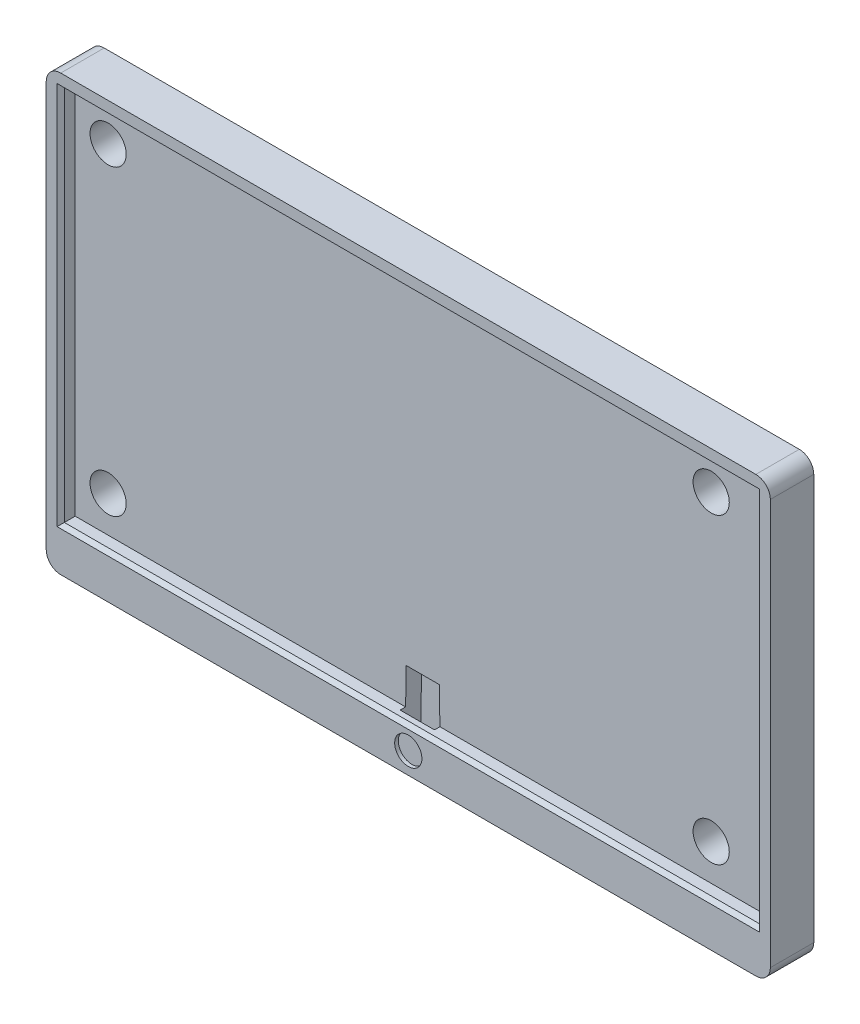
ISO-10303-21;
HEADER;
FILE_DESCRIPTION(('STEP AP214'),'2;1');
FILE_NAME('part.step','',(''),(''),'','','');
FILE_SCHEMA(('AUTOMOTIVE_DESIGN { 1 0 10303 214 1 1 1 1 }'));
ENDSEC;
DATA;
#1=APPLICATION_CONTEXT('core data for automotive mechanical design processes');
#2=APPLICATION_PROTOCOL_DEFINITION('international standard','automotive_design',2000,#1);
#3=PRODUCT_CONTEXT('',#1,'mechanical');
#4=PRODUCT('Part','Part','',(#3));
#5=PRODUCT_RELATED_PRODUCT_CATEGORY('part','',(#4));
#6=PRODUCT_DEFINITION_FORMATION('','',#4);
#7=PRODUCT_DEFINITION_CONTEXT('part definition',#1,'design');
#8=PRODUCT_DEFINITION('design','',#6,#7);
#9=PRODUCT_DEFINITION_SHAPE('','',#8);
#10=(LENGTH_UNIT() NAMED_UNIT(*) SI_UNIT(.MILLI.,.METRE.));
#11=(NAMED_UNIT(*) PLANE_ANGLE_UNIT() SI_UNIT($,.RADIAN.));
#12=(NAMED_UNIT(*) SI_UNIT($,.STERADIAN.) SOLID_ANGLE_UNIT());
#13=UNCERTAINTY_MEASURE_WITH_UNIT(LENGTH_MEASURE(1.E-05),#10,'distance_accuracy_value','');
#14=(GEOMETRIC_REPRESENTATION_CONTEXT(3) GLOBAL_UNCERTAINTY_ASSIGNED_CONTEXT((#13)) GLOBAL_UNIT_ASSIGNED_CONTEXT((#10,
#11,#12)) REPRESENTATION_CONTEXT('',''));
#15=CARTESIAN_POINT('',(0.,0.,0.));
#16=DIRECTION('',(0.,0.,1.));
#17=DIRECTION('',(1.,0.,0.));
#18=AXIS2_PLACEMENT_3D('',#15,#16,#17);
#19=CARTESIAN_POINT('',(0.,-19.,0.));
#20=DIRECTION('',(0.,-1.,0.));
#21=DIRECTION('',(0.,0.,-1.));
#22=AXIS2_PLACEMENT_3D('',#19,#20,#21);
#23=PLANE('',#22);
#24=DIRECTION('',(0.,0.,-1.));
#25=VECTOR('',#24,1.);
#26=CARTESIAN_POINT('',(2.28299428578961,-19.,0.));
#27=LINE('',#26,#25);
#28=CARTESIAN_POINT('',(2.28299428578961,-19.,-1.15));
#29=VERTEX_POINT('',#28);
#30=CARTESIAN_POINT('',(2.28299428578961,-19.,1.));
#31=VERTEX_POINT('',#30);
#32=EDGE_CURVE('E237',#29,#31,#27,.F.);
#33=ORIENTED_EDGE('',*,*,#32,.T.);
#34=DIRECTION('',(-1.,0.,0.));
#35=VECTOR('',#34,1.);
#36=CARTESIAN_POINT('',(0.,-19.,1.));
#37=LINE('',#36,#35);
#38=CARTESIAN_POINT('',(-2.2829942857896,-19.,1.));
#39=VERTEX_POINT('',#38);
#40=EDGE_CURVE('E263',#31,#39,#37,.T.);
#41=ORIENTED_EDGE('',*,*,#40,.T.);
#42=DIRECTION('',(0.,0.,1.));
#43=VECTOR('',#42,1.);
#44=CARTESIAN_POINT('',(-2.2829942857896,-19.,0.));
#45=LINE('',#44,#43);
#46=CARTESIAN_POINT('',(-2.2829942857896,-19.,-1.15));
#47=VERTEX_POINT('',#46);
#48=EDGE_CURVE('E225',#39,#47,#45,.F.);
#49=ORIENTED_EDGE('',*,*,#48,.T.);
#50=DIRECTION('',(1.,0.,0.));
#51=VECTOR('',#50,1.);
#52=CARTESIAN_POINT('',(2.475,-19.,-1.15));
#53=LINE('',#52,#51);
#54=EDGE_CURVE('E221',#47,#29,#53,.T.);
#55=ORIENTED_EDGE('',*,*,#54,.T.);
#56=EDGE_LOOP('',(#33,#41,#49,#55));
#57=FACE_BOUND('',#56,.T.);
#58=ADVANCED_FACE('F37',(#57),#23,.T.);
#59=CARTESIAN_POINT('',(-50.,30.,-3.));
#60=DIRECTION('',(-1.,0.,0.));
#61=DIRECTION('',(0.,0.,1.));
#62=AXIS2_PLACEMENT_3D('',#59,#60,#61);
#63=PLANE('',#62);
#64=DIRECTION('',(0.,-1.,0.));
#65=VECTOR('',#64,1.);
#66=CARTESIAN_POINT('',(-50.,30.,-3.));
#67=LINE('',#66,#65);
#68=CARTESIAN_POINT('',(-50.,28.,-3.));
#69=VERTEX_POINT('',#68);
#70=CARTESIAN_POINT('',(-50.,-28.,-3.));
#71=VERTEX_POINT('',#70);
#72=EDGE_CURVE('E251',#69,#71,#67,.T.);
#73=ORIENTED_EDGE('',*,*,#72,.T.);
#74=DIRECTION('',(0.,0.,1.));
#75=VECTOR('',#74,1.);
#76=CARTESIAN_POINT('',(-50.,-28.,-3.));
#77=LINE('',#76,#75);
#78=CARTESIAN_POINT('',(-50.,-28.,3.));
#79=VERTEX_POINT('',#78);
#80=EDGE_CURVE('E311',#71,#79,#77,.T.);
#81=ORIENTED_EDGE('',*,*,#80,.T.);
#82=DIRECTION('',(0.,-1.,0.));
#83=VECTOR('',#82,1.);
#84=CARTESIAN_POINT('',(-50.,30.,3.));
#85=LINE('',#84,#83);
#86=CARTESIAN_POINT('',(-50.,28.,3.));
#87=VERTEX_POINT('',#86);
#88=EDGE_CURVE('E238',#87,#79,#85,.T.);
#89=ORIENTED_EDGE('',*,*,#88,.F.);
#90=DIRECTION('',(0.,0.,1.));
#91=VECTOR('',#90,1.);
#92=CARTESIAN_POINT('',(-50.,28.,-3.));
#93=LINE('',#92,#91);
#94=EDGE_CURVE('E309',#87,#69,#93,.F.);
#95=ORIENTED_EDGE('',*,*,#94,.T.);
#96=EDGE_LOOP('',(#73,#81,#89,#95));
#97=FACE_BOUND('',#96,.T.);
#98=ADVANCED_FACE('F390',(#97),#63,.T.);
#99=CARTESIAN_POINT('',(-50.,30.,-3.));
#100=DIRECTION('',(0.,1.,0.));
#101=DIRECTION('',(-1.,0.,0.));
#102=AXIS2_PLACEMENT_3D('',#99,#100,#101);
#103=PLANE('',#102);
#104=DIRECTION('',(-1.,0.,0.));
#105=VECTOR('',#104,1.);
#106=CARTESIAN_POINT('',(-50.,30.,3.));
#107=LINE('',#106,#105);
#108=CARTESIAN_POINT('',(48.,30.,3.));
#109=VERTEX_POINT('',#108);
#110=CARTESIAN_POINT('',(-48.,30.,3.));
#111=VERTEX_POINT('',#110);
#112=EDGE_CURVE('E248',#109,#111,#107,.T.);
#113=ORIENTED_EDGE('',*,*,#112,.F.);
#114=DIRECTION('',(0.,0.,1.));
#115=VECTOR('',#114,1.);
#116=CARTESIAN_POINT('',(48.,30.,-3.));
#117=LINE('',#116,#115);
#118=CARTESIAN_POINT('',(48.,30.,-3.));
#119=VERTEX_POINT('',#118);
#120=EDGE_CURVE('E307',#109,#119,#117,.F.);
#121=ORIENTED_EDGE('',*,*,#120,.T.);
#122=DIRECTION('',(-1.,0.,0.));
#123=VECTOR('',#122,1.);
#124=CARTESIAN_POINT('',(-50.,30.,-3.));
#125=LINE('',#124,#123);
#126=CARTESIAN_POINT('',(-48.,30.,-3.));
#127=VERTEX_POINT('',#126);
#128=EDGE_CURVE('E260',#119,#127,#125,.T.);
#129=ORIENTED_EDGE('',*,*,#128,.T.);
#130=DIRECTION('',(0.,0.,1.));
#131=VECTOR('',#130,1.);
#132=CARTESIAN_POINT('',(-48.,30.,-3.));
#133=LINE('',#132,#131);
#134=EDGE_CURVE('E304',#127,#111,#133,.T.);
#135=ORIENTED_EDGE('',*,*,#134,.T.);
#136=EDGE_LOOP('',(#113,#121,#129,#135));
#137=FACE_BOUND('',#136,.T.);
#138=ADVANCED_FACE('F396',(#137),#103,.T.);
#139=CARTESIAN_POINT('',(50.,30.,-3.));
#140=DIRECTION('',(1.,0.,0.));
#141=DIRECTION('',(0.,0.,-1.));
#142=AXIS2_PLACEMENT_3D('',#139,#140,#141);
#143=PLANE('',#142);
#144=DIRECTION('',(0.,1.,0.));
#145=VECTOR('',#144,1.);
#146=CARTESIAN_POINT('',(50.,30.,3.));
#147=LINE('',#146,#145);
#148=CARTESIAN_POINT('',(50.,-28.,3.));
#149=VERTEX_POINT('',#148);
#150=CARTESIAN_POINT('',(50.,28.,3.));
#151=VERTEX_POINT('',#150);
#152=EDGE_CURVE('E245',#149,#151,#147,.T.);
#153=ORIENTED_EDGE('',*,*,#152,.F.);
#154=DIRECTION('',(0.,0.,1.));
#155=VECTOR('',#154,1.);
#156=CARTESIAN_POINT('',(50.,-28.,-3.));
#157=LINE('',#156,#155);
#158=CARTESIAN_POINT('',(50.,-28.,-3.));
#159=VERTEX_POINT('',#158);
#160=EDGE_CURVE('E294',#149,#159,#157,.F.);
#161=ORIENTED_EDGE('',*,*,#160,.T.);
#162=DIRECTION('',(0.,1.,0.));
#163=VECTOR('',#162,1.);
#164=CARTESIAN_POINT('',(50.,30.,-3.));
#165=LINE('',#164,#163);
#166=CARTESIAN_POINT('',(50.,28.,-3.));
#167=VERTEX_POINT('',#166);
#168=EDGE_CURVE('E257',#159,#167,#165,.T.);
#169=ORIENTED_EDGE('',*,*,#168,.T.);
#170=DIRECTION('',(0.,0.,1.));
#171=VECTOR('',#170,1.);
#172=CARTESIAN_POINT('',(50.,28.,-3.));
#173=LINE('',#172,#171);
#174=EDGE_CURVE('E291',#167,#151,#173,.T.);
#175=ORIENTED_EDGE('',*,*,#174,.T.);
#176=EDGE_LOOP('',(#153,#161,#169,#175));
#177=FACE_BOUND('',#176,.T.);
#178=ADVANCED_FACE('F423',(#177),#143,.T.);
#179=CARTESIAN_POINT('',(-50.,-30.,-3.));
#180=DIRECTION('',(0.,-1.,0.));
#181=DIRECTION('',(1.,0.,0.));
#182=AXIS2_PLACEMENT_3D('',#179,#180,#181);
#183=PLANE('',#182);
#184=DIRECTION('',(0.,0.,1.));
#185=VECTOR('',#184,1.);
#186=CARTESIAN_POINT('',(2.475,-30.,-1.15));
#187=LINE('',#186,#185);
#188=CARTESIAN_POINT('',(2.475,-30.,-1.15));
#189=VERTEX_POINT('',#188);
#190=CARTESIAN_POINT('',(2.475,-30.,1.75));
#191=VERTEX_POINT('',#190);
#192=EDGE_CURVE('E220',#189,#191,#187,.T.);
#193=ORIENTED_EDGE('',*,*,#192,.F.);
#194=DIRECTION('',(1.,0.,0.));
#195=VECTOR('',#194,1.);
#196=CARTESIAN_POINT('',(2.475,-30.,-1.15));
#197=LINE('',#196,#195);
#198=CARTESIAN_POINT('',(-2.47499999999999,-30.,-1.15));
#199=VERTEX_POINT('',#198);
#200=EDGE_CURVE('E234',#199,#189,#197,.T.);
#201=ORIENTED_EDGE('',*,*,#200,.F.);
#202=DIRECTION('',(0.,0.,-1.));
#203=VECTOR('',#202,1.);
#204=CARTESIAN_POINT('',(-2.47499999999999,-30.,-1.15));
#205=LINE('',#204,#203);
#206=CARTESIAN_POINT('',(-2.47499999999999,-30.,1.75));
#207=VERTEX_POINT('',#206);
#208=EDGE_CURVE('E231',#207,#199,#205,.T.);
#209=ORIENTED_EDGE('',*,*,#208,.F.);
#210=DIRECTION('',(-1.,0.,0.));
#211=VECTOR('',#210,1.);
#212=CARTESIAN_POINT('',(2.475,-30.,1.75));
#213=LINE('',#212,#211);
#214=EDGE_CURVE('E228',#191,#207,#213,.T.);
#215=ORIENTED_EDGE('',*,*,#214,.F.);
#216=EDGE_LOOP('',(#193,#201,#209,#215));
#217=FACE_BOUND('',#216,.T.);
#218=DIRECTION('',(1.,0.,0.));
#219=VECTOR('',#218,1.);
#220=CARTESIAN_POINT('',(-50.,-30.,-3.));
#221=LINE('',#220,#219);
#222=CARTESIAN_POINT('',(-48.,-30.,-3.));
#223=VERTEX_POINT('',#222);
#224=CARTESIAN_POINT('',(48.,-30.,-3.));
#225=VERTEX_POINT('',#224);
#226=EDGE_CURVE('E254',#223,#225,#221,.T.);
#227=ORIENTED_EDGE('',*,*,#226,.T.);
#228=DIRECTION('',(0.,0.,1.));
#229=VECTOR('',#228,1.);
#230=CARTESIAN_POINT('',(48.,-30.,-3.));
#231=LINE('',#230,#229);
#232=CARTESIAN_POINT('',(48.,-30.,3.));
#233=VERTEX_POINT('',#232);
#234=EDGE_CURVE('E280',#225,#233,#231,.T.);
#235=ORIENTED_EDGE('',*,*,#234,.T.);
#236=DIRECTION('',(1.,0.,0.));
#237=VECTOR('',#236,1.);
#238=CARTESIAN_POINT('',(-50.,-30.,3.));
#239=LINE('',#238,#237);
#240=CARTESIAN_POINT('',(-48.,-30.,3.));
#241=VERTEX_POINT('',#240);
#242=EDGE_CURVE('E241',#241,#233,#239,.T.);
#243=ORIENTED_EDGE('',*,*,#242,.F.);
#244=DIRECTION('',(0.,0.,1.));
#245=VECTOR('',#244,1.);
#246=CARTESIAN_POINT('',(-48.,-30.,-3.));
#247=LINE('',#246,#245);
#248=EDGE_CURVE('E278',#241,#223,#247,.F.);
#249=ORIENTED_EDGE('',*,*,#248,.T.);
#250=EDGE_LOOP('',(#227,#235,#243,#249));
#251=FACE_BOUND('',#250,.T.);
#252=ADVANCED_FACE('F419',(#217,#251),#183,.T.);
#253=CARTESIAN_POINT('',(0.,0.,-3.));
#254=DIRECTION('',(0.,0.,1.));
#255=DIRECTION('',(1.,0.,0.));
#256=AXIS2_PLACEMENT_3D('',#253,#254,#255);
#257=PLANE('',#256);
#258=CARTESIAN_POINT('',(39.8327710388283,22.8,-3.));
#259=DIRECTION('',(0.,0.,1.));
#260=DIRECTION('',(1.,0.,0.));
#261=AXIS2_PLACEMENT_3D('',#258,#259,#260);
#262=CIRCLE('',#261,2.5);
#263=CARTESIAN_POINT('',(42.3327710388283,22.8,-3.));
#264=VERTEX_POINT('',#263);
#265=EDGE_CURVE('E343',#264,#264,#262,.T.);
#266=ORIENTED_EDGE('',*,*,#265,.T.);
#267=EDGE_LOOP('',(#266));
#268=FACE_BOUND('',#267,.T.);
#269=CARTESIAN_POINT('',(39.8327710388283,-19.,-3.));
#270=DIRECTION('',(0.,0.,1.));
#271=DIRECTION('',(1.,0.,0.));
#272=AXIS2_PLACEMENT_3D('',#269,#270,#271);
#273=CIRCLE('',#272,2.5);
#274=CARTESIAN_POINT('',(42.3327710388283,-19.,-3.));
#275=VERTEX_POINT('',#274);
#276=EDGE_CURVE('E352',#275,#275,#273,.T.);
#277=ORIENTED_EDGE('',*,*,#276,.T.);
#278=EDGE_LOOP('',(#277));
#279=FACE_BOUND('',#278,.T.);
#280=CARTESIAN_POINT('',(-43.4539320423583,-19.,-3.));
#281=DIRECTION('',(0.,0.,1.));
#282=DIRECTION('',(1.,0.,0.));
#283=AXIS2_PLACEMENT_3D('',#280,#281,#282);
#284=CIRCLE('',#283,2.5);
#285=CARTESIAN_POINT('',(-40.9539320423583,-19.,-3.));
#286=VERTEX_POINT('',#285);
#287=EDGE_CURVE('E358',#286,#286,#284,.T.);
#288=ORIENTED_EDGE('',*,*,#287,.T.);
#289=EDGE_LOOP('',(#288));
#290=FACE_BOUND('',#289,.T.);
#291=CARTESIAN_POINT('',(-43.4539320423583,22.8,-3.));
#292=DIRECTION('',(0.,0.,1.));
#293=DIRECTION('',(1.,0.,0.));
#294=AXIS2_PLACEMENT_3D('',#291,#292,#293);
#295=CIRCLE('',#294,2.5);
#296=CARTESIAN_POINT('',(-40.9539320423583,22.8,-3.));
#297=VERTEX_POINT('',#296);
#298=EDGE_CURVE('E197',#297,#297,#295,.T.);
#299=ORIENTED_EDGE('',*,*,#298,.T.);
#300=EDGE_LOOP('',(#299));
#301=FACE_BOUND('',#300,.T.);
#302=ORIENTED_EDGE('',*,*,#168,.F.);
#303=CARTESIAN_POINT('',(48.,-28.,-3.));
#304=DIRECTION('',(0.,0.,1.));
#305=DIRECTION('',(1.,0.,0.));
#306=AXIS2_PLACEMENT_3D('',#303,#304,#305);
#307=CIRCLE('',#306,2.);
#308=EDGE_CURVE('E302',#159,#225,#307,.F.);
#309=ORIENTED_EDGE('',*,*,#308,.T.);
#310=ORIENTED_EDGE('',*,*,#226,.F.);
#311=CARTESIAN_POINT('',(-48.,-28.,-3.));
#312=DIRECTION('',(0.,0.,1.));
#313=DIRECTION('',(1.,0.,0.));
#314=AXIS2_PLACEMENT_3D('',#311,#312,#313);
#315=CIRCLE('',#314,2.);
#316=EDGE_CURVE('E298',#223,#71,#315,.F.);
#317=ORIENTED_EDGE('',*,*,#316,.T.);
#318=ORIENTED_EDGE('',*,*,#72,.F.);
#319=CARTESIAN_POINT('',(-48.,28.,-3.));
#320=DIRECTION('',(0.,0.,1.));
#321=DIRECTION('',(1.,0.,0.));
#322=AXIS2_PLACEMENT_3D('',#319,#320,#321);
#323=CIRCLE('',#322,2.);
#324=EDGE_CURVE('E296',#69,#127,#323,.F.);
#325=ORIENTED_EDGE('',*,*,#324,.T.);
#326=ORIENTED_EDGE('',*,*,#128,.F.);
#327=CARTESIAN_POINT('',(48.,28.,-3.));
#328=DIRECTION('',(0.,0.,1.));
#329=DIRECTION('',(1.,0.,0.));
#330=AXIS2_PLACEMENT_3D('',#327,#328,#329);
#331=CIRCLE('',#330,2.);
#332=EDGE_CURVE('E300',#119,#167,#331,.F.);
#333=ORIENTED_EDGE('',*,*,#332,.T.);
#334=EDGE_LOOP('',(#302,#309,#310,#317,#318,#325,#326,#333));
#335=FACE_BOUND('',#334,.T.);
#336=ADVANCED_FACE('F415',(#268,#279,#290,#301,#335),#257,.F.);
#337=CARTESIAN_POINT('',(0.,0.,3.));
#338=DIRECTION('',(0.,0.,1.));
#339=DIRECTION('',(1.,0.,0.));
#340=AXIS2_PLACEMENT_3D('',#337,#338,#339);
#341=PLANE('',#340);
#342=CARTESIAN_POINT('',(0.,-27.0562959366963,3.));
#343=DIRECTION('',(0.,0.,1.));
#344=DIRECTION('',(1.,0.,0.));
#345=AXIS2_PLACEMENT_3D('',#342,#343,#344);
#346=CIRCLE('',#345,1.88256954487913);
#347=CARTESIAN_POINT('',(1.88256954487913,-27.0562959366963,3.));
#348=VERTEX_POINT('',#347);
#349=EDGE_CURVE('E700',#348,#348,#346,.T.);
#350=ORIENTED_EDGE('',*,*,#349,.F.);
#351=EDGE_LOOP('',(#350));
#352=FACE_BOUND('',#351,.T.);
#353=DIRECTION('',(1.,0.,0.));
#354=VECTOR('',#353,1.);
#355=CARTESIAN_POINT('',(48.,28.5,3.));
#356=LINE('',#355,#354);
#357=CARTESIAN_POINT('',(-48.5,28.5,3.));
#358=VERTEX_POINT('',#357);
#359=CARTESIAN_POINT('',(48.5,28.5,3.));
#360=VERTEX_POINT('',#359);
#361=EDGE_CURVE('E321',#358,#360,#356,.T.);
#362=ORIENTED_EDGE('',*,*,#361,.T.);
#363=DIRECTION('',(0.,-1.,0.));
#364=VECTOR('',#363,1.);
#365=CARTESIAN_POINT('',(48.5,-24.,3.));
#366=LINE('',#365,#364);
#367=CARTESIAN_POINT('',(48.5,-24.5,3.));
#368=VERTEX_POINT('',#367);
#369=EDGE_CURVE('E323',#360,#368,#366,.T.);
#370=ORIENTED_EDGE('',*,*,#369,.T.);
#371=DIRECTION('',(-1.,0.,0.));
#372=VECTOR('',#371,1.);
#373=CARTESIAN_POINT('',(-48.,-24.5,3.));
#374=LINE('',#373,#372);
#375=CARTESIAN_POINT('',(-48.5,-24.5,3.));
#376=VERTEX_POINT('',#375);
#377=EDGE_CURVE('E317',#368,#376,#374,.T.);
#378=ORIENTED_EDGE('',*,*,#377,.T.);
#379=DIRECTION('',(0.,1.,0.));
#380=VECTOR('',#379,1.);
#381=CARTESIAN_POINT('',(-48.5,28.,3.));
#382=LINE('',#381,#380);
#383=EDGE_CURVE('E319',#376,#358,#382,.T.);
#384=ORIENTED_EDGE('',*,*,#383,.T.);
#385=EDGE_LOOP('',(#362,#370,#378,#384));
#386=FACE_BOUND('',#385,.T.);
#387=ORIENTED_EDGE('',*,*,#242,.T.);
#388=CARTESIAN_POINT('',(48.,-28.,3.));
#389=DIRECTION('',(0.,0.,1.));
#390=DIRECTION('',(1.,0.,0.));
#391=AXIS2_PLACEMENT_3D('',#388,#389,#390);
#392=CIRCLE('',#391,2.);
#393=EDGE_CURVE('E289',#233,#149,#392,.T.);
#394=ORIENTED_EDGE('',*,*,#393,.T.);
#395=ORIENTED_EDGE('',*,*,#152,.T.);
#396=CARTESIAN_POINT('',(48.,28.,3.));
#397=DIRECTION('',(0.,0.,1.));
#398=DIRECTION('',(1.,0.,0.));
#399=AXIS2_PLACEMENT_3D('',#396,#397,#398);
#400=CIRCLE('',#399,2.);
#401=EDGE_CURVE('E287',#151,#109,#400,.T.);
#402=ORIENTED_EDGE('',*,*,#401,.T.);
#403=ORIENTED_EDGE('',*,*,#112,.T.);
#404=CARTESIAN_POINT('',(-48.,28.,3.));
#405=DIRECTION('',(0.,0.,1.));
#406=DIRECTION('',(1.,0.,0.));
#407=AXIS2_PLACEMENT_3D('',#404,#405,#406);
#408=CIRCLE('',#407,2.);
#409=EDGE_CURVE('E283',#111,#87,#408,.T.);
#410=ORIENTED_EDGE('',*,*,#409,.T.);
#411=ORIENTED_EDGE('',*,*,#88,.T.);
#412=CARTESIAN_POINT('',(-48.,-28.,3.));
#413=DIRECTION('',(0.,0.,1.));
#414=DIRECTION('',(1.,0.,0.));
#415=AXIS2_PLACEMENT_3D('',#412,#413,#414);
#416=CIRCLE('',#415,2.);
#417=EDGE_CURVE('E285',#79,#241,#416,.T.);
#418=ORIENTED_EDGE('',*,*,#417,.T.);
#419=EDGE_LOOP('',(#387,#394,#395,#402,#403,#410,#411,#418));
#420=FACE_BOUND('',#419,.T.);
#421=ADVANCED_FACE('F412',(#352,#386,#420),#341,.T.);
#422=CARTESIAN_POINT('',(2.475,-30.,-1.15));
#423=DIRECTION('',(-0.999847695156391,-0.0174524064372837,0.));
#424=DIRECTION('',(0.0174524064372837,-0.999847695156391,0.));
#425=AXIS2_PLACEMENT_3D('',#422,#423,#424);
#426=PLANE('',#425);
#427=DIRECTION('',(-0.0174524064372837,0.999847695156391,0.));
#428=VECTOR('',#427,1.);
#429=CARTESIAN_POINT('',(2.475,-30.,1.75));
#430=LINE('',#429,#428);
#431=CARTESIAN_POINT('',(2.3702696104307,-24.,1.75));
#432=VERTEX_POINT('',#431);
#433=EDGE_CURVE('E224',#432,#191,#430,.F.);
#434=ORIENTED_EDGE('',*,*,#433,.F.);
#435=DIRECTION('',(0.,0.,1.));
#436=VECTOR('',#435,1.);
#437=CARTESIAN_POINT('',(2.3702696104307,-24.,-1.15));
#438=LINE('',#437,#436);
#439=CARTESIAN_POINT('',(2.3702696104307,-24.,1.));
#440=VERTEX_POINT('',#439);
#441=EDGE_CURVE('E217',#432,#440,#438,.F.);
#442=ORIENTED_EDGE('',*,*,#441,.T.);
#443=DIRECTION('',(-0.0174524064372837,0.999847695156391,0.));
#444=VECTOR('',#443,1.);
#445=CARTESIAN_POINT('',(2.475,-30.,1.));
#446=LINE('',#445,#444);
#447=EDGE_CURVE('E214',#31,#440,#446,.F.);
#448=ORIENTED_EDGE('',*,*,#447,.F.);
#449=ORIENTED_EDGE('',*,*,#32,.F.);
#450=DIRECTION('',(-0.0174524064372837,0.999847695156391,0.));
#451=VECTOR('',#450,1.);
#452=CARTESIAN_POINT('',(2.28305276813624,-19.003350451395,-1.15));
#453=LINE('',#452,#451);
#454=EDGE_CURVE('E242',#29,#189,#453,.F.);
#455=ORIENTED_EDGE('',*,*,#454,.T.);
#456=ORIENTED_EDGE('',*,*,#192,.T.);
#457=EDGE_LOOP('',(#434,#442,#448,#449,#455,#456));
#458=FACE_BOUND('',#457,.T.);
#459=ADVANCED_FACE('F406',(#458),#426,.T.);
#460=CARTESIAN_POINT('',(2.475,-19.,-1.15));
#461=DIRECTION('',(0.,0.,-1.));
#462=DIRECTION('',(-1.,0.,0.));
#463=AXIS2_PLACEMENT_3D('',#460,#461,#462);
#464=PLANE('',#463);
#465=ORIENTED_EDGE('',*,*,#200,.T.);
#466=ORIENTED_EDGE('',*,*,#454,.F.);
#467=ORIENTED_EDGE('',*,*,#54,.F.);
#468=DIRECTION('',(0.0174524064372834,0.999847695156391,0.));
#469=VECTOR('',#468,1.);
#470=CARTESIAN_POINT('',(-2.47499999999999,-30.,-1.15));
#471=LINE('',#470,#469);
#472=EDGE_CURVE('E266',#47,#199,#471,.F.);
#473=ORIENTED_EDGE('',*,*,#472,.T.);
#474=EDGE_LOOP('',(#465,#466,#467,#473));
#475=FACE_BOUND('',#474,.T.);
#476=ADVANCED_FACE('F402',(#475),#464,.F.);
#477=CARTESIAN_POINT('',(-2.47499999999999,-30.,-1.15));
#478=DIRECTION('',(0.999847695156391,-0.0174524064372834,0.));
#479=DIRECTION('',(0.0174524064372834,0.999847695156391,0.));
#480=AXIS2_PLACEMENT_3D('',#477,#478,#479);
#481=PLANE('',#480);
#482=DIRECTION('',(-0.0174524064372834,-0.999847695156391,0.));
#483=VECTOR('',#482,1.);
#484=CARTESIAN_POINT('',(-2.47499999999999,-30.,1.));
#485=LINE('',#484,#483);
#486=CARTESIAN_POINT('',(-2.37026961043069,-24.,1.));
#487=VERTEX_POINT('',#486);
#488=EDGE_CURVE('E208',#487,#39,#485,.F.);
#489=ORIENTED_EDGE('',*,*,#488,.F.);
#490=DIRECTION('',(0.,0.,-1.));
#491=VECTOR('',#490,1.);
#492=CARTESIAN_POINT('',(-2.37026961043069,-24.,-1.15));
#493=LINE('',#492,#491);
#494=CARTESIAN_POINT('',(-2.37026961043069,-24.,1.75));
#495=VERTEX_POINT('',#494);
#496=EDGE_CURVE('E188',#487,#495,#493,.F.);
#497=ORIENTED_EDGE('',*,*,#496,.T.);
#498=DIRECTION('',(0.0174524064372834,0.999847695156391,0.));
#499=VECTOR('',#498,1.);
#500=CARTESIAN_POINT('',(-2.2815450650085,-18.9169741970563,1.75));
#501=LINE('',#500,#499);
#502=EDGE_CURVE('E264',#495,#207,#501,.F.);
#503=ORIENTED_EDGE('',*,*,#502,.T.);
#504=ORIENTED_EDGE('',*,*,#208,.T.);
#505=ORIENTED_EDGE('',*,*,#472,.F.);
#506=ORIENTED_EDGE('',*,*,#48,.F.);
#507=EDGE_LOOP('',(#489,#497,#503,#504,#505,#506));
#508=FACE_BOUND('',#507,.T.);
#509=ADVANCED_FACE('F405',(#508),#481,.T.);
#510=CARTESIAN_POINT('',(2.475,-19.,1.75));
#511=DIRECTION('',(0.,0.,1.));
#512=DIRECTION('',(1.,0.,0.));
#513=AXIS2_PLACEMENT_3D('',#510,#511,#512);
#514=PLANE('',#513);
#515=ORIENTED_EDGE('',*,*,#502,.F.);
#516=DIRECTION('',(1.,0.,0.));
#517=VECTOR('',#516,1.);
#518=CARTESIAN_POINT('',(2.475,-24.,1.75));
#519=LINE('',#518,#517);
#520=EDGE_CURVE('E275',#495,#432,#519,.T.);
#521=ORIENTED_EDGE('',*,*,#520,.T.);
#522=ORIENTED_EDGE('',*,*,#433,.T.);
#523=ORIENTED_EDGE('',*,*,#214,.T.);
#524=EDGE_LOOP('',(#515,#521,#522,#523));
#525=FACE_BOUND('',#524,.T.);
#526=ADVANCED_FACE('F408',(#525),#514,.F.);
#527=CARTESIAN_POINT('',(-48.,-24.,1.));
#528=DIRECTION('',(0.,-1.,0.));
#529=DIRECTION('',(0.,0.,-1.));
#530=AXIS2_PLACEMENT_3D('',#527,#528,#529);
#531=PLANE('',#530);
#532=DIRECTION('',(0.,0.,1.));
#533=VECTOR('',#532,1.);
#534=CARTESIAN_POINT('',(-48.,-24.,1.));
#535=LINE('',#534,#533);
#536=CARTESIAN_POINT('',(-48.,-24.,1.));
#537=VERTEX_POINT('',#536);
#538=CARTESIAN_POINT('',(-48.,-24.,2.5));
#539=VERTEX_POINT('',#538);
#540=EDGE_CURVE('E173',#537,#539,#535,.T.);
#541=ORIENTED_EDGE('',*,*,#540,.T.);
#542=DIRECTION('',(1.,0.,0.));
#543=VECTOR('',#542,1.);
#544=CARTESIAN_POINT('',(48.,-24.,2.5));
#545=LINE('',#544,#543);
#546=CARTESIAN_POINT('',(48.,-24.,2.5));
#547=VERTEX_POINT('',#546);
#548=EDGE_CURVE('E12',#539,#547,#545,.T.);
#549=ORIENTED_EDGE('',*,*,#548,.T.);
#550=DIRECTION('',(0.,0.,1.));
#551=VECTOR('',#550,1.);
#552=CARTESIAN_POINT('',(48.,-24.,1.));
#553=LINE('',#552,#551);
#554=CARTESIAN_POINT('',(48.,-24.,1.));
#555=VERTEX_POINT('',#554);
#556=EDGE_CURVE('E181',#555,#547,#553,.T.);
#557=ORIENTED_EDGE('',*,*,#556,.F.);
#558=DIRECTION('',(1.,0.,0.));
#559=VECTOR('',#558,1.);
#560=CARTESIAN_POINT('',(-48.,-24.,1.));
#561=LINE('',#560,#559);
#562=EDGE_CURVE('E192',#440,#555,#561,.T.);
#563=ORIENTED_EDGE('',*,*,#562,.F.);
#564=ORIENTED_EDGE('',*,*,#441,.F.);
#565=ORIENTED_EDGE('',*,*,#520,.F.);
#566=ORIENTED_EDGE('',*,*,#496,.F.);
#567=EDGE_CURVE('E185',#537,#487,#561,.T.);
#568=ORIENTED_EDGE('',*,*,#567,.F.);
#569=EDGE_LOOP('',(#541,#549,#557,#563,#564,#565,#566,#568));
#570=FACE_BOUND('',#569,.T.);
#571=ADVANCED_FACE('F186',(#570),#531,.F.);
#572=CARTESIAN_POINT('',(0.,0.,1.));
#573=DIRECTION('',(0.,0.,1.));
#574=DIRECTION('',(1.,0.,0.));
#575=AXIS2_PLACEMENT_3D('',#572,#573,#574);
#576=PLANE('',#575);
#577=CARTESIAN_POINT('',(39.8327710388283,22.8,1.));
#578=DIRECTION('',(0.,0.,1.));
#579=DIRECTION('',(1.,0.,0.));
#580=AXIS2_PLACEMENT_3D('',#577,#578,#579);
#581=CIRCLE('',#580,2.5);
#582=CARTESIAN_POINT('',(42.3327710388283,22.8,1.));
#583=VERTEX_POINT('',#582);
#584=EDGE_CURVE('E338',#583,#583,#581,.T.);
#585=ORIENTED_EDGE('',*,*,#584,.F.);
#586=EDGE_LOOP('',(#585));
#587=FACE_BOUND('',#586,.T.);
#588=CARTESIAN_POINT('',(39.8327710388283,-19.,1.));
#589=DIRECTION('',(0.,0.,1.));
#590=DIRECTION('',(1.,0.,0.));
#591=AXIS2_PLACEMENT_3D('',#588,#589,#590);
#592=CIRCLE('',#591,2.5);
#593=CARTESIAN_POINT('',(42.3327710388283,-19.,1.));
#594=VERTEX_POINT('',#593);
#595=EDGE_CURVE('E348',#594,#594,#592,.T.);
#596=ORIENTED_EDGE('',*,*,#595,.F.);
#597=EDGE_LOOP('',(#596));
#598=FACE_BOUND('',#597,.T.);
#599=CARTESIAN_POINT('',(-43.4539320423583,-19.,1.));
#600=DIRECTION('',(0.,0.,1.));
#601=DIRECTION('',(1.,0.,0.));
#602=AXIS2_PLACEMENT_3D('',#599,#600,#601);
#603=CIRCLE('',#602,2.5);
#604=CARTESIAN_POINT('',(-40.9539320423583,-19.,1.));
#605=VERTEX_POINT('',#604);
#606=EDGE_CURVE('E355',#605,#605,#603,.T.);
#607=ORIENTED_EDGE('',*,*,#606,.F.);
#608=EDGE_LOOP('',(#607));
#609=FACE_BOUND('',#608,.T.);
#610=CARTESIAN_POINT('',(-43.4539320423583,22.8,1.));
#611=DIRECTION('',(0.,0.,1.));
#612=DIRECTION('',(1.,0.,0.));
#613=AXIS2_PLACEMENT_3D('',#610,#611,#612);
#614=CIRCLE('',#613,2.5);
#615=CARTESIAN_POINT('',(-40.9539320423583,22.8,1.));
#616=VERTEX_POINT('',#615);
#617=EDGE_CURVE('E200',#616,#616,#614,.T.);
#618=ORIENTED_EDGE('',*,*,#617,.F.);
#619=EDGE_LOOP('',(#618));
#620=FACE_BOUND('',#619,.T.);
#621=ORIENTED_EDGE('',*,*,#447,.T.);
#622=ORIENTED_EDGE('',*,*,#562,.T.);
#623=DIRECTION('',(0.,1.,0.));
#624=VECTOR('',#623,1.);
#625=CARTESIAN_POINT('',(48.,28.,1.));
#626=LINE('',#625,#624);
#627=CARTESIAN_POINT('',(48.,28.,1.));
#628=VERTEX_POINT('',#627);
#629=EDGE_CURVE('E191',#555,#628,#626,.T.);
#630=ORIENTED_EDGE('',*,*,#629,.T.);
#631=DIRECTION('',(-1.,0.,0.));
#632=VECTOR('',#631,1.);
#633=CARTESIAN_POINT('',(-48.,28.,1.));
#634=LINE('',#633,#632);
#635=CARTESIAN_POINT('',(-48.,28.,1.));
#636=VERTEX_POINT('',#635);
#637=EDGE_CURVE('E182',#628,#636,#634,.T.);
#638=ORIENTED_EDGE('',*,*,#637,.T.);
#639=DIRECTION('',(0.,-1.,0.));
#640=VECTOR('',#639,1.);
#641=CARTESIAN_POINT('',(-48.,28.,1.));
#642=LINE('',#641,#640);
#643=EDGE_CURVE('E177',#636,#537,#642,.T.);
#644=ORIENTED_EDGE('',*,*,#643,.T.);
#645=ORIENTED_EDGE('',*,*,#567,.T.);
#646=ORIENTED_EDGE('',*,*,#488,.T.);
#647=ORIENTED_EDGE('',*,*,#40,.F.);
#648=EDGE_LOOP('',(#621,#622,#630,#638,#644,#645,#646,#647));
#649=FACE_BOUND('',#648,.T.);
#650=ADVANCED_FACE('F194',(#587,#598,#609,#620,#649),#576,.T.);
#651=CARTESIAN_POINT('',(-48.,28.,1.));
#652=DIRECTION('',(-1.,0.,0.));
#653=DIRECTION('',(0.,-1.,0.));
#654=AXIS2_PLACEMENT_3D('',#651,#652,#653);
#655=PLANE('',#654);
#656=DIRECTION('',(0.,0.,1.));
#657=VECTOR('',#656,1.);
#658=CARTESIAN_POINT('',(-48.,28.,1.));
#659=LINE('',#658,#657);
#660=CARTESIAN_POINT('',(-48.,28.,2.5));
#661=VERTEX_POINT('',#660);
#662=EDGE_CURVE('E206',#636,#661,#659,.T.);
#663=ORIENTED_EDGE('',*,*,#662,.T.);
#664=DIRECTION('',(0.,-1.,0.));
#665=VECTOR('',#664,1.);
#666=CARTESIAN_POINT('',(-48.,-24.,2.5));
#667=LINE('',#666,#665);
#668=EDGE_CURVE('E46',#661,#539,#667,.T.);
#669=ORIENTED_EDGE('',*,*,#668,.T.);
#670=ORIENTED_EDGE('',*,*,#540,.F.);
#671=ORIENTED_EDGE('',*,*,#643,.F.);
#672=EDGE_LOOP('',(#663,#669,#670,#671));
#673=FACE_BOUND('',#672,.T.);
#674=ADVANCED_FACE('F175',(#673),#655,.F.);
#675=CARTESIAN_POINT('',(-48.,28.,1.));
#676=DIRECTION('',(0.,1.,0.));
#677=DIRECTION('',(0.,0.,1.));
#678=AXIS2_PLACEMENT_3D('',#675,#676,#677);
#679=PLANE('',#678);
#680=DIRECTION('',(0.,0.,1.));
#681=VECTOR('',#680,1.);
#682=CARTESIAN_POINT('',(48.,28.,1.));
#683=LINE('',#682,#681);
#684=CARTESIAN_POINT('',(48.,28.,2.5));
#685=VERTEX_POINT('',#684);
#686=EDGE_CURVE('E209',#628,#685,#683,.T.);
#687=ORIENTED_EDGE('',*,*,#686,.T.);
#688=DIRECTION('',(-1.,0.,0.));
#689=VECTOR('',#688,1.);
#690=CARTESIAN_POINT('',(-48.,28.,2.5));
#691=LINE('',#690,#689);
#692=EDGE_CURVE('E61',#685,#661,#691,.T.);
#693=ORIENTED_EDGE('',*,*,#692,.T.);
#694=ORIENTED_EDGE('',*,*,#662,.F.);
#695=ORIENTED_EDGE('',*,*,#637,.F.);
#696=EDGE_LOOP('',(#687,#693,#694,#695));
#697=FACE_BOUND('',#696,.T.);
#698=ADVANCED_FACE('F479',(#697),#679,.F.);
#699=CARTESIAN_POINT('',(48.,28.,1.));
#700=DIRECTION('',(1.,0.,0.));
#701=DIRECTION('',(0.,1.,0.));
#702=AXIS2_PLACEMENT_3D('',#699,#700,#701);
#703=PLANE('',#702);
#704=ORIENTED_EDGE('',*,*,#556,.T.);
#705=DIRECTION('',(0.,1.,0.));
#706=VECTOR('',#705,1.);
#707=CARTESIAN_POINT('',(48.,28.,2.5));
#708=LINE('',#707,#706);
#709=EDGE_CURVE('E314',#547,#685,#708,.T.);
#710=ORIENTED_EDGE('',*,*,#709,.T.);
#711=ORIENTED_EDGE('',*,*,#686,.F.);
#712=ORIENTED_EDGE('',*,*,#629,.F.);
#713=EDGE_LOOP('',(#704,#710,#711,#712));
#714=FACE_BOUND('',#713,.T.);
#715=ADVANCED_FACE('F441',(#714),#703,.F.);
#716=CARTESIAN_POINT('',(48.,-28.,-3.));
#717=DIRECTION('',(0.,0.,1.));
#718=DIRECTION('',(1.,0.,0.));
#719=AXIS2_PLACEMENT_3D('',#716,#717,#718);
#720=CYLINDRICAL_SURFACE('',#719,2.);
#721=ORIENTED_EDGE('',*,*,#308,.F.);
#722=ORIENTED_EDGE('',*,*,#160,.F.);
#723=ORIENTED_EDGE('',*,*,#393,.F.);
#724=ORIENTED_EDGE('',*,*,#234,.F.);
#725=EDGE_LOOP('',(#721,#722,#723,#724));
#726=FACE_BOUND('',#725,.T.);
#727=ADVANCED_FACE('F437',(#726),#720,.T.);
#728=CARTESIAN_POINT('',(48.,28.,-3.));
#729=DIRECTION('',(0.,0.,1.));
#730=DIRECTION('',(1.,0.,0.));
#731=AXIS2_PLACEMENT_3D('',#728,#729,#730);
#732=CYLINDRICAL_SURFACE('',#731,2.);
#733=ORIENTED_EDGE('',*,*,#332,.F.);
#734=ORIENTED_EDGE('',*,*,#120,.F.);
#735=ORIENTED_EDGE('',*,*,#401,.F.);
#736=ORIENTED_EDGE('',*,*,#174,.F.);
#737=EDGE_LOOP('',(#733,#734,#735,#736));
#738=FACE_BOUND('',#737,.T.);
#739=ADVANCED_FACE('F440',(#738),#732,.T.);
#740=CARTESIAN_POINT('',(-48.,-28.,-3.));
#741=DIRECTION('',(0.,0.,1.));
#742=DIRECTION('',(1.,0.,0.));
#743=AXIS2_PLACEMENT_3D('',#740,#741,#742);
#744=CYLINDRICAL_SURFACE('',#743,2.);
#745=ORIENTED_EDGE('',*,*,#316,.F.);
#746=ORIENTED_EDGE('',*,*,#248,.F.);
#747=ORIENTED_EDGE('',*,*,#417,.F.);
#748=ORIENTED_EDGE('',*,*,#80,.F.);
#749=EDGE_LOOP('',(#745,#746,#747,#748));
#750=FACE_BOUND('',#749,.T.);
#751=ADVANCED_FACE('F385',(#750),#744,.T.);
#752=CARTESIAN_POINT('',(-48.,28.,-3.));
#753=DIRECTION('',(0.,0.,1.));
#754=DIRECTION('',(1.,0.,0.));
#755=AXIS2_PLACEMENT_3D('',#752,#753,#754);
#756=CYLINDRICAL_SURFACE('',#755,2.);
#757=ORIENTED_EDGE('',*,*,#324,.F.);
#758=ORIENTED_EDGE('',*,*,#94,.F.);
#759=ORIENTED_EDGE('',*,*,#409,.F.);
#760=ORIENTED_EDGE('',*,*,#134,.F.);
#761=EDGE_LOOP('',(#757,#758,#759,#760));
#762=FACE_BOUND('',#761,.T.);
#763=ADVANCED_FACE('F375',(#762),#756,.T.);
#764=CARTESIAN_POINT('',(-43.4539320423583,22.8,-3.));
#765=DIRECTION('',(0.,0.,1.));
#766=DIRECTION('',(1.,0.,0.));
#767=AXIS2_PLACEMENT_3D('',#764,#765,#766);
#768=CYLINDRICAL_SURFACE('',#767,2.5);
#769=ORIENTED_EDGE('',*,*,#298,.F.);
#770=EDGE_LOOP('',(#769));
#771=FACE_BOUND('',#770,.T.);
#772=ORIENTED_EDGE('',*,*,#617,.T.);
#773=EDGE_LOOP('',(#772));
#774=FACE_BOUND('',#773,.T.);
#775=ADVANCED_FACE('F373',(#771,#774),#768,.F.);
#776=CARTESIAN_POINT('',(-43.4539320423583,-19.,-3.));
#777=DIRECTION('',(0.,0.,1.));
#778=DIRECTION('',(1.,0.,0.));
#779=AXIS2_PLACEMENT_3D('',#776,#777,#778);
#780=CYLINDRICAL_SURFACE('',#779,2.5);
#781=ORIENTED_EDGE('',*,*,#287,.F.);
#782=EDGE_LOOP('',(#781));
#783=FACE_BOUND('',#782,.T.);
#784=ORIENTED_EDGE('',*,*,#606,.T.);
#785=EDGE_LOOP('',(#784));
#786=FACE_BOUND('',#785,.T.);
#787=ADVANCED_FACE('F364',(#783,#786),#780,.F.);
#788=CARTESIAN_POINT('',(39.8327710388283,-19.,-3.));
#789=DIRECTION('',(0.,0.,1.));
#790=DIRECTION('',(1.,0.,0.));
#791=AXIS2_PLACEMENT_3D('',#788,#789,#790);
#792=CYLINDRICAL_SURFACE('',#791,2.5);
#793=ORIENTED_EDGE('',*,*,#276,.F.);
#794=EDGE_LOOP('',(#793));
#795=FACE_BOUND('',#794,.T.);
#796=ORIENTED_EDGE('',*,*,#595,.T.);
#797=EDGE_LOOP('',(#796));
#798=FACE_BOUND('',#797,.T.);
#799=ADVANCED_FACE('F382',(#795,#798),#792,.F.);
#800=CARTESIAN_POINT('',(39.8327710388283,22.8,-3.));
#801=DIRECTION('',(0.,0.,1.));
#802=DIRECTION('',(1.,0.,0.));
#803=AXIS2_PLACEMENT_3D('',#800,#801,#802);
#804=CYLINDRICAL_SURFACE('',#803,2.5);
#805=ORIENTED_EDGE('',*,*,#265,.F.);
#806=EDGE_LOOP('',(#805));
#807=FACE_BOUND('',#806,.T.);
#808=ORIENTED_EDGE('',*,*,#584,.T.);
#809=EDGE_LOOP('',(#808));
#810=FACE_BOUND('',#809,.T.);
#811=ADVANCED_FACE('F461',(#807,#810),#804,.F.);
#812=CARTESIAN_POINT('',(-48.,28.,2.5));
#813=DIRECTION('',(0.707106781186545,0.,0.70710678118655));
#814=DIRECTION('',(0.,1.,0.));
#815=AXIS2_PLACEMENT_3D('',#812,#813,#814);
#816=PLANE('',#815);
#817=DIRECTION('',(-0.577350269189623,0.577350269189635,0.577350269189619));
#818=VECTOR('',#817,1.);
#819=CARTESIAN_POINT('',(-48.,28.,2.5));
#820=LINE('',#819,#818);
#821=EDGE_CURVE('E332',#358,#661,#820,.F.);
#822=ORIENTED_EDGE('',*,*,#821,.F.);
#823=ORIENTED_EDGE('',*,*,#383,.F.);
#824=DIRECTION('',(-0.577350269189623,-0.577350269189635,0.577350269189619));
#825=VECTOR('',#824,1.);
#826=CARTESIAN_POINT('',(-30.6666666666665,-6.66666666666612,-14.8333333333334));
#827=LINE('',#826,#825);
#828=EDGE_CURVE('E41',#539,#376,#827,.T.);
#829=ORIENTED_EDGE('',*,*,#828,.F.);
#830=ORIENTED_EDGE('',*,*,#668,.F.);
#831=EDGE_LOOP('',(#822,#823,#829,#830));
#832=FACE_BOUND('',#831,.T.);
#833=ADVANCED_FACE('F39',(#832),#816,.T.);
#834=CARTESIAN_POINT('',(-48.,-24.,2.5));
#835=DIRECTION('',(0.,0.707106781186538,0.707106781186557));
#836=DIRECTION('',(-1.,0.,0.));
#837=AXIS2_PLACEMENT_3D('',#834,#835,#836);
#838=PLANE('',#837);
#839=ORIENTED_EDGE('',*,*,#828,.T.);
#840=ORIENTED_EDGE('',*,*,#377,.F.);
#841=DIRECTION('',(-0.577350269189623,0.577350269189635,-0.577350269189619));
#842=VECTOR('',#841,1.);
#843=CARTESIAN_POINT('',(30.6666666666665,-6.66666666666612,-14.8333333333334));
#844=LINE('',#843,#842);
#845=EDGE_CURVE('E330',#547,#368,#844,.F.);
#846=ORIENTED_EDGE('',*,*,#845,.F.);
#847=ORIENTED_EDGE('',*,*,#548,.F.);
#848=EDGE_LOOP('',(#839,#840,#846,#847));
#849=FACE_BOUND('',#848,.T.);
#850=ADVANCED_FACE('F456',(#849),#838,.T.);
#851=CARTESIAN_POINT('',(-48.,28.,2.5));
#852=DIRECTION('',(0.,-0.707106781186538,0.707106781186557));
#853=DIRECTION('',(1.,0.,0.));
#854=AXIS2_PLACEMENT_3D('',#851,#852,#853);
#855=PLANE('',#854);
#856=ORIENTED_EDGE('',*,*,#821,.T.);
#857=ORIENTED_EDGE('',*,*,#692,.F.);
#858=DIRECTION('',(0.577350269189623,0.577350269189635,0.577350269189619));
#859=VECTOR('',#858,1.);
#860=CARTESIAN_POINT('',(48.,28.,2.5));
#861=LINE('',#860,#859);
#862=EDGE_CURVE('E328',#360,#685,#861,.F.);
#863=ORIENTED_EDGE('',*,*,#862,.F.);
#864=ORIENTED_EDGE('',*,*,#361,.F.);
#865=EDGE_LOOP('',(#856,#857,#863,#864));
#866=FACE_BOUND('',#865,.T.);
#867=ADVANCED_FACE('F453',(#866),#855,.T.);
#868=CARTESIAN_POINT('',(48.,28.,2.5));
#869=DIRECTION('',(-0.707106781186545,0.,0.70710678118655));
#870=DIRECTION('',(0.,-1.,0.));
#871=AXIS2_PLACEMENT_3D('',#868,#869,#870);
#872=PLANE('',#871);
#873=ORIENTED_EDGE('',*,*,#845,.T.);
#874=ORIENTED_EDGE('',*,*,#369,.F.);
#875=ORIENTED_EDGE('',*,*,#862,.T.);
#876=ORIENTED_EDGE('',*,*,#709,.F.);
#877=EDGE_LOOP('',(#873,#874,#875,#876));
#878=FACE_BOUND('',#877,.T.);
#879=ADVANCED_FACE('F449',(#878),#872,.T.);
#880=CARTESIAN_POINT('',(0.,-27.0562959366963,2.5));
#881=DIRECTION('',(0.,0.,1.));
#882=DIRECTION('',(1.,0.,0.));
#883=AXIS2_PLACEMENT_3D('',#880,#881,#882);
#884=CYLINDRICAL_SURFACE('',#883,1.88256954487913);
#885=CARTESIAN_POINT('',(0.,-27.0562959366963,2.5));
#886=DIRECTION('',(0.,0.,1.));
#887=DIRECTION('',(1.,0.,0.));
#888=AXIS2_PLACEMENT_3D('',#885,#886,#887);
#889=CIRCLE('',#888,1.88256954487913);
#890=CARTESIAN_POINT('',(1.88256954487913,-27.0562959366963,2.5));
#891=VERTEX_POINT('',#890);
#892=EDGE_CURVE('E331',#891,#891,#889,.T.);
#893=ORIENTED_EDGE('',*,*,#892,.F.);
#894=EDGE_LOOP('',(#893));
#895=FACE_BOUND('',#894,.T.);
#896=ORIENTED_EDGE('',*,*,#349,.T.);
#897=EDGE_LOOP('',(#896));
#898=FACE_BOUND('',#897,.T.);
#899=ADVANCED_FACE('F452',(#895,#898),#884,.F.);
#900=CARTESIAN_POINT('',(0.,-27.0562959366963,2.5));
#901=DIRECTION('',(0.,0.,1.));
#902=DIRECTION('',(1.,0.,0.));
#903=AXIS2_PLACEMENT_3D('',#900,#901,#902);
#904=PLANE('',#903);
#905=ORIENTED_EDGE('',*,*,#892,.T.);
#906=EDGE_LOOP('',(#905));
#907=FACE_BOUND('',#906,.T.);
#908=ADVANCED_FACE('F551',(#907),#904,.T.);
#909=CLOSED_SHELL('',(#58,#98,#138,#178,#252,#336,#421,#459,#476,#509,#526,#571,#650,#674,#698,
#715,#727,#739,#751,#763,#775,#787,#799,#811,#833,#850,#867,#879,#899,#908));
#910=MANIFOLD_SOLID_BREP('B2',#909);
#911=ADVANCED_BREP_SHAPE_REPRESENTATION('',(#18,#910),#14);
#912=SHAPE_DEFINITION_REPRESENTATION(#9,#911);
ENDSEC;
END-ISO-10303-21;
